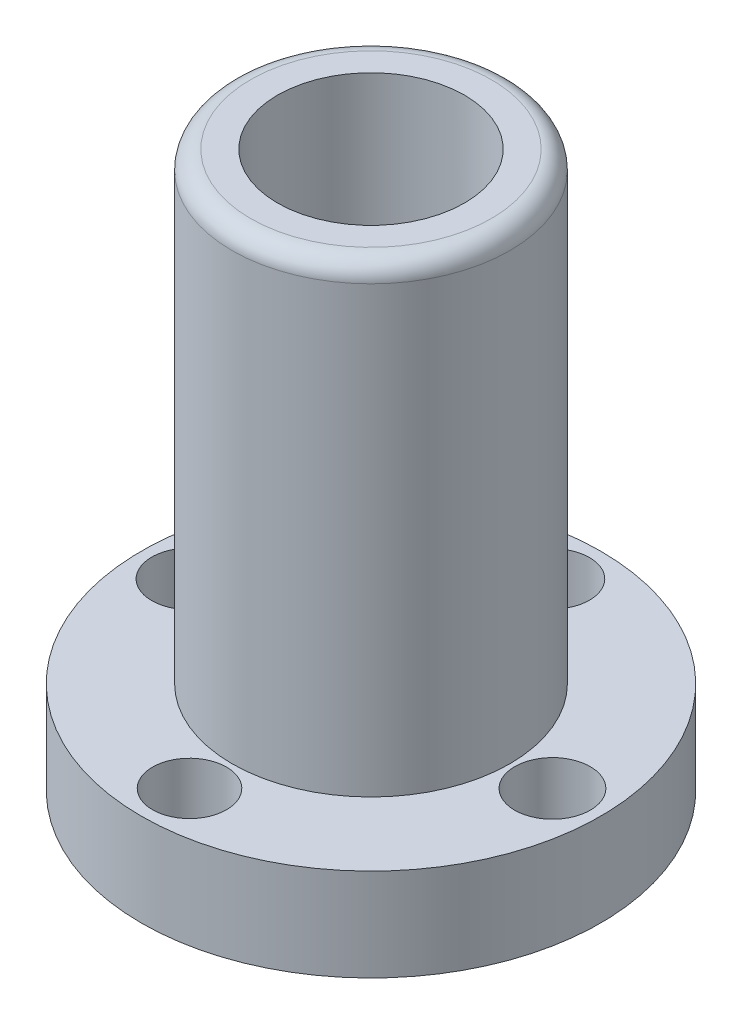
ISO-10303-21;
HEADER;
FILE_DESCRIPTION(('STEP AP214'),'2;1');
FILE_NAME('part.step','',(''),(''),'','','');
FILE_SCHEMA(('AUTOMOTIVE_DESIGN { 1 0 10303 214 1 1 1 1 }'));
ENDSEC;
DATA;
#1=APPLICATION_CONTEXT('core data for automotive mechanical design processes');
#2=APPLICATION_PROTOCOL_DEFINITION('international standard','automotive_design',2000,#1);
#3=PRODUCT_CONTEXT('',#1,'mechanical');
#4=PRODUCT('Part','Part','',(#3));
#5=PRODUCT_RELATED_PRODUCT_CATEGORY('part','',(#4));
#6=PRODUCT_DEFINITION_FORMATION('','',#4);
#7=PRODUCT_DEFINITION_CONTEXT('part definition',#1,'design');
#8=PRODUCT_DEFINITION('design','',#6,#7);
#9=PRODUCT_DEFINITION_SHAPE('','',#8);
#10=(LENGTH_UNIT() NAMED_UNIT(*) SI_UNIT(.MILLI.,.METRE.));
#11=(NAMED_UNIT(*) PLANE_ANGLE_UNIT() SI_UNIT($,.RADIAN.));
#12=(NAMED_UNIT(*) SI_UNIT($,.STERADIAN.) SOLID_ANGLE_UNIT());
#13=UNCERTAINTY_MEASURE_WITH_UNIT(LENGTH_MEASURE(1.E-05),#10,'distance_accuracy_value','');
#14=(GEOMETRIC_REPRESENTATION_CONTEXT(3) GLOBAL_UNCERTAINTY_ASSIGNED_CONTEXT((#13)) GLOBAL_UNIT_ASSIGNED_CONTEXT((#10,
#11,#12)) REPRESENTATION_CONTEXT('',''));
#15=CARTESIAN_POINT('',(0.,0.,0.));
#16=DIRECTION('',(0.,0.,1.));
#17=DIRECTION('',(1.,0.,0.));
#18=AXIS2_PLACEMENT_3D('',#15,#16,#17);
#19=CARTESIAN_POINT('',(0.,63.5,0.));
#20=DIRECTION('',(0.,-1.,0.));
#21=DIRECTION('',(0.,0.,-1.));
#22=AXIS2_PLACEMENT_3D('',#19,#20,#21);
#23=CYLINDRICAL_SURFACE('',#22,19.05);
#24=CARTESIAN_POINT('',(0.,60.96,0.));
#25=DIRECTION('',(0.,1.,0.));
#26=DIRECTION('',(0.,0.,1.));
#27=AXIS2_PLACEMENT_3D('',#24,#25,#26);
#28=CIRCLE('',#27,19.05);
#29=CARTESIAN_POINT('',(0.,60.96,19.05));
#30=VERTEX_POINT('',#29);
#31=EDGE_CURVE('E10',#30,#30,#28,.F.);
#32=ORIENTED_EDGE('',*,*,#31,.T.);
#33=EDGE_LOOP('',(#32));
#34=FACE_BOUND('',#33,.T.);
#35=CARTESIAN_POINT('',(0.,38.0825748199491,-19.05));
#36=CARTESIAN_POINT('',(-0.172758741358228,38.0825748790905,-19.0500000384333));
#37=CARTESIAN_POINT('',(-0.34551662965528,38.0754996208819,-19.0476445732295));
#38=CARTESIAN_POINT('',(-0.689812472477129,38.047261925439,-19.0382858165429));
#39=CARTESIAN_POINT('',(-0.861349961429442,38.0260943757799,-19.0312808383048));
#40=CARTESIAN_POINT('',(-1.20183631296349,37.9698760867755,-19.0128154502155));
#41=CARTESIAN_POINT('',(-1.37078591701533,37.9348294043391,-19.0013563423367));
#42=CARTESIAN_POINT('',(-1.70501431641908,37.8511572605666,-18.9742865479488));
#43=CARTESIAN_POINT('',(-1.8702916672818,37.8025265545438,-18.9586742580392));
#44=CARTESIAN_POINT('',(-2.1956424795937,37.6922304266037,-18.9237514775853));
#45=CARTESIAN_POINT('',(-2.35572606982077,37.630592385169,-18.9044487632974));
#46=CARTESIAN_POINT('',(-2.67007332741114,37.4946971090675,-18.8626181128214));
#47=CARTESIAN_POINT('',(-2.82433481554671,37.4204352053935,-18.8400889838129));
#48=CARTESIAN_POINT('',(-3.1259942833207,37.2598867496302,-18.7923914503261));
#49=CARTESIAN_POINT('',(-3.2733936927839,37.1736027176418,-18.7672235992545));
#50=CARTESIAN_POINT('',(-3.56054614434711,36.9895713739917,-18.7148690091986));
#51=CARTESIAN_POINT('',(-3.70029641674528,36.8918199498104,-18.6876815472167));
#52=CARTESIAN_POINT('',(-3.97548663151716,36.6823250581777,-18.6311122831325));
#53=CARTESIAN_POINT('',(-4.11065998429786,36.5702425918535,-18.6016886361541));
#54=CARTESIAN_POINT('',(-4.37116418252414,36.3353235369984,-18.5422026355642));
#55=CARTESIAN_POINT('',(-4.49649481057155,36.2124867110605,-18.5121402678639));
#56=CARTESIAN_POINT('',(-4.73659907435506,35.9567688923567,-18.4521665336531));
#57=CARTESIAN_POINT('',(-4.85136865466811,35.8238840765686,-18.4222552292831));
#58=CARTESIAN_POINT('',(-5.06953681577943,35.5489584882713,-18.3634163650611));
#59=CARTESIAN_POINT('',(-5.17293928190751,35.4069208707259,-18.3344884714248));
#60=CARTESIAN_POINT('',(-5.37056069778378,35.1102473225343,-18.2775944667648));
#61=CARTESIAN_POINT('',(-5.46442583457717,34.9553653425727,-18.2496806678776));
#62=CARTESIAN_POINT('',(-5.63868274825869,34.637827187178,-18.1965945848705));
#63=CARTESIAN_POINT('',(-5.71907983886636,34.475174110482,-18.1714212209111));
#64=CARTESIAN_POINT('',(-5.86579081226659,34.1431056198522,-18.1245947036832));
#65=CARTESIAN_POINT('',(-5.93210217996037,33.9736890046486,-18.1029421792454));
#66=CARTESIAN_POINT('',(-6.04999310442957,33.6294083627931,-18.0638850606314));
#67=CARTESIAN_POINT('',(-6.10157936553327,33.4545468555454,-18.046478533783));
#68=CARTESIAN_POINT('',(-6.18809247052206,33.1065016615772,-18.0169928528198));
#69=CARTESIAN_POINT('',(-6.22351480284536,32.9334544529906,-18.0047562505523));
#70=CARTESIAN_POINT('',(-6.27979113923005,32.5848012115491,-17.9852054127276));
#71=CARTESIAN_POINT('',(-6.30065121152858,32.409196275704,-17.9778891268728));
#72=CARTESIAN_POINT('',(-6.32761085318649,32.0567295112865,-17.9684180162086));
#73=CARTESIAN_POINT('',(-6.33371141708538,31.8798677682071,-17.9662628436281));
#74=CARTESIAN_POINT('',(-6.3310904123134,31.5262705079991,-17.9671866794293));
#75=CARTESIAN_POINT('',(-6.32236925888813,31.3495349874731,-17.9702655411742));
#76=CARTESIAN_POINT('',(-6.29093380941547,31.0056218671124,-17.9812933522872));
#77=CARTESIAN_POINT('',(-6.26887667601348,30.838376340971,-17.989013495871));
#78=CARTESIAN_POINT('',(-6.21154509447218,30.5063770757717,-18.0088902269284));
#79=CARTESIAN_POINT('',(-6.17626619713879,30.3416241949396,-18.0210483077557));
#80=CARTESIAN_POINT('',(-6.09281756533854,30.0158292212252,-18.049432471288));
#81=CARTESIAN_POINT('',(-6.04465144783841,29.8547861009028,-18.0656574124949));
#82=CARTESIAN_POINT('',(-5.93580628095184,29.5373375602914,-18.1017123095426));
#83=CARTESIAN_POINT('',(-5.87512248096222,29.3809339265919,-18.1215436337074));
#84=CARTESIAN_POINT('',(-5.74067868517598,29.0713749620272,-18.1645854568596));
#85=CARTESIAN_POINT('',(-5.66672888241313,28.9183087937848,-18.1878439895405));
#86=CARTESIAN_POINT('',(-5.50693648456175,28.618871598642,-18.2368619429469));
#87=CARTESIAN_POINT('',(-5.42108982569247,28.4725028823087,-18.2626222173249));
#88=CARTESIAN_POINT('',(-5.23809866873727,28.1873424380407,-18.3159466536954));
#89=CARTESIAN_POINT('',(-5.14095340835934,28.0485512222726,-18.3435109373455));
#90=CARTESIAN_POINT('',(-4.93597928793087,27.7793276345485,-18.3997255482519));
#91=CARTESIAN_POINT('',(-4.82815005226849,27.6488955567367,-18.4283759136692));
#92=CARTESIAN_POINT('',(-4.59655817548651,27.3905508155845,-18.4875408598896));
#93=CARTESIAN_POINT('',(-4.4722579513675,27.263123958766,-18.5180747627384));
#94=CARTESIAN_POINT('',(-4.21336009983195,27.0191727225032,-18.5786911215486));
#95=CARTESIAN_POINT('',(-4.07876573206832,26.9026449176287,-18.6087737168374));
#96=CARTESIAN_POINT('',(-3.80000614264082,26.6811577692198,-18.6676927700696));
#97=CARTESIAN_POINT('',(-3.65583640785801,26.5762039436953,-18.6965286296706));
#98=CARTESIAN_POINT('',(-3.35893929796405,26.3787053879637,-18.7521418648088));
#99=CARTESIAN_POINT('',(-3.20621534137352,26.2861557501402,-18.7789200526472));
#100=CARTESIAN_POINT('',(-2.89152254174225,26.113231138993,-18.8299564960847));
#101=CARTESIAN_POINT('',(-2.72947480342792,26.0329910958707,-18.8541860181795));
#102=CARTESIAN_POINT('',(-2.39875770675027,25.8865405747073,-18.8991082927784));
#103=CARTESIAN_POINT('',(-2.23009094374286,25.8203246616065,-18.9198024148254));
#104=CARTESIAN_POINT('',(-1.88730205631504,25.7024849212884,-18.9570648648825));
#105=CARTESIAN_POINT('',(-1.71318036910442,25.6508599279222,-18.9736335225992));
#106=CARTESIAN_POINT('',(-1.36078988405157,25.5626954161125,-19.0021575407015));
#107=CARTESIAN_POINT('',(-1.18252127631754,25.5261552075679,-19.0141131121257));
#108=CARTESIAN_POINT('',(-0.831000721606231,25.4697732164938,-19.0326448181413));
#109=CARTESIAN_POINT('',(-0.657864267968082,25.4492788797706,-19.0394308318231));
#110=CARTESIAN_POINT('',(-0.31037245729307,25.4226360300412,-19.0482642631045));
#111=CARTESIAN_POINT('',(-0.136017138267487,25.416487071647,-19.0503118278211));
#112=CARTESIAN_POINT('',(0.212569747668963,25.4185946459723,-19.0496112652542));
#113=CARTESIAN_POINT('',(0.386801329123272,25.4268490373734,-19.0468638508311));
#114=CARTESIAN_POINT('',(0.733851475677078,25.4576782131763,-19.0366514450436));
#115=CARTESIAN_POINT('',(0.90667005489474,25.4802528543183,-19.0291865008733));
#116=CARTESIAN_POINT('',(1.24463172118035,25.5386437736785,-19.0100291210048));
#117=CARTESIAN_POINT('',(1.40985202910706,25.5740568858467,-18.9984656160848));
#118=CARTESIAN_POINT('',(1.73668633540616,25.6578824799328,-18.9713815830356));
#119=CARTESIAN_POINT('',(1.89829911373565,25.7062992895795,-18.9558597376278));
#120=CARTESIAN_POINT('',(2.21676427021394,25.8157096956631,-18.9212607094191));
#121=CARTESIAN_POINT('',(2.37361791272227,25.8766999175586,-18.9021844807008));
#122=CARTESIAN_POINT('',(2.68169397444251,26.0108138228231,-18.8609433258));
#123=CARTESIAN_POINT('',(2.83291423786995,26.0839420939539,-18.8387772322652));
#124=CARTESIAN_POINT('',(3.13259439174383,26.2438271091812,-18.7913001240879));
#125=CARTESIAN_POINT('',(3.28088181749425,26.3308873394494,-18.7659226137298));
#126=CARTESIAN_POINT('',(3.56968695587054,26.5166142265103,-18.7131343046047));
#127=CARTESIAN_POINT('',(3.71020196444326,26.6152848857415,-18.6857228058751));
#128=CARTESIAN_POINT('',(3.98260890475969,26.8235682446168,-18.6295644224943));
#129=CARTESIAN_POINT('',(4.11450001390219,26.9331819855676,-18.6008174108995));
#130=CARTESIAN_POINT('',(4.36889239519896,27.1626663443282,-18.542715717156));
#131=CARTESIAN_POINT('',(4.49139342337646,27.2825372284719,-18.5133610192432));
#132=CARTESIAN_POINT('',(4.73163445893604,27.5374954676621,-18.453459064093));
#133=CARTESIAN_POINT('',(4.84890557627608,27.6730266443306,-18.4229181921575));
#134=CARTESIAN_POINT('',(5.07160309727794,27.9536307959917,-18.3628604139613));
#135=CARTESIAN_POINT('',(5.17703342108384,28.0987005876566,-18.3333431710569));
#136=CARTESIAN_POINT('',(5.37540532205743,28.3975824008164,-18.2761642905736));
#137=CARTESIAN_POINT('',(5.46834166691185,28.5513980468264,-18.2485034328378));
#138=CARTESIAN_POINT('',(5.64093843007773,28.8666687790544,-18.1958911392692));
#139=CARTESIAN_POINT('',(5.72060437603298,29.0281206483218,-18.1709385768414));
#140=CARTESIAN_POINT('',(5.86593291899585,29.3573736074323,-18.1245453503832));
#141=CARTESIAN_POINT('',(5.93161865497503,29.525163656059,-18.1030988971727));
#142=CARTESIAN_POINT('',(6.04854398349377,29.8660994864381,-18.0643685723504));
#143=CARTESIAN_POINT('',(6.09978950383178,30.0392430380571,-18.0470829930998));
#144=CARTESIAN_POINT('',(6.18736740881959,30.3896349509939,-18.0172452968136));
#145=CARTESIAN_POINT('',(6.22370229294923,30.566882619069,-18.0046923864662));
#146=CARTESIAN_POINT('',(6.28109446538322,30.9241192638955,-17.9847513163245));
#147=CARTESIAN_POINT('',(6.30215251791139,31.1041081030598,-17.977362898177));
#148=CARTESIAN_POINT('',(6.32808397957286,31.4560901044334,-17.9682505612009));
#149=CARTESIAN_POINT('',(6.33373249045736,31.6280195849512,-17.9662554108844));
#150=CARTESIAN_POINT('',(6.3310236609693,31.9718154189481,-17.9672102114742));
#151=CARTESIAN_POINT('',(6.32266155916293,32.1436817311045,-17.9701618435189));
#152=CARTESIAN_POINT('',(6.29201158853923,32.4859362493896,-17.9809163236018));
#153=CARTESIAN_POINT('',(6.2697297892027,32.6563250669447,-17.9887170572528));
#154=CARTESIAN_POINT('',(6.21145012744112,32.994526693111,-18.0089238084305));
#155=CARTESIAN_POINT('',(6.17544711354875,33.1623385095716,-18.0213315555606));
#156=CARTESIAN_POINT('',(6.09088005239366,33.4909524688672,-18.050086752918));
#157=CARTESIAN_POINT('',(6.04257067548311,33.6518273444269,-18.0663539151614));
#158=CARTESIAN_POINT('',(5.93346280866565,33.9689295510621,-18.1024810396607));
#159=CARTESIAN_POINT('',(5.87265988688725,34.1251552103316,-18.122342276554));
#160=CARTESIAN_POINT('',(5.73905817111509,34.4319209353972,-18.1650936181698));
#161=CARTESIAN_POINT('',(5.66626154802567,34.5824620240713,-18.1879831746077));
#162=CARTESIAN_POINT('',(5.50915674571604,34.8770716293237,-18.2361849828228));
#163=CARTESIAN_POINT('',(5.42484443010359,35.0211377953089,-18.2614981041538));
#164=CARTESIAN_POINT('',(5.24139286869342,35.3080238810844,-18.3150161912518));
#165=CARTESIAN_POINT('',(5.14176991966739,35.4505201430004,-18.3432988934858));
#166=CARTESIAN_POINT('',(4.93127584320059,35.7267036039243,-18.4010033731485));
#167=CARTESIAN_POINT('',(4.82040432973481,35.8603905003552,-18.4304251896474));
#168=CARTESIAN_POINT('',(4.58805512867713,36.1182241285312,-18.4896356258381));
#169=CARTESIAN_POINT('',(4.4665729785069,36.2423668045349,-18.5194243952933));
#170=CARTESIAN_POINT('',(4.21381192805015,36.4802647763996,-18.5785663572807));
#171=CARTESIAN_POINT('',(4.08253624850751,36.5940234600596,-18.607919689239));
#172=CARTESIAN_POINT('',(3.80560097562437,36.8147278498839,-18.666566493594));
#173=CARTESIAN_POINT('',(3.6595795141902,36.9212326701318,-18.6958126623739));
#174=CARTESIAN_POINT('',(3.35873886283523,37.1215004937406,-18.7521940558181));
#175=CARTESIAN_POINT('',(3.20392300011109,37.215268270987,-18.779330069736));
#176=CARTESIAN_POINT('',(2.88642833663928,37.3893990360078,-18.8307433232952));
#177=CARTESIAN_POINT('',(2.72374799457043,37.4697593822757,-18.8550199993188));
#178=CARTESIAN_POINT('',(2.39174278650552,37.6163430460394,-18.9000028993825));
#179=CARTESIAN_POINT('',(2.22242094129071,37.6825727043742,-18.9207107240619));
#180=CARTESIAN_POINT('',(1.88623566406596,37.7976203853797,-18.9571060605557));
#181=CARTESIAN_POINT('',(1.71961893912662,37.8471005004598,-18.9729810465308));
#182=CARTESIAN_POINT('',(1.38261535732259,37.9322381534811,-19.0005115816049));
#183=CARTESIAN_POINT('',(1.21223006436902,37.9679013156047,-19.0121688473964));
#184=CARTESIAN_POINT('',(0.868862755816188,38.0250994478533,-19.0309521166366));
#185=CARTESIAN_POINT('',(0.695880847853719,38.0466350019612,-19.0380783073827));
#186=CARTESIAN_POINT('',(0.348599003178901,38.0753726529962,-19.0476022279681));
#187=CARTESIAN_POINT('',(0.174299067419016,38.0825747602804,-19.049999961224));
#188=CARTESIAN_POINT('',(0.,38.0825748199491,-19.05));
#189=B_SPLINE_CURVE_WITH_KNOTS('',3,(#35,#36,#37,#38,#39,#40,#41,#42,#43,#44,#45,#46,#47,#48,
#49,#50,#51,#52,#53,#54,#55,#56,#57,#58,#59,#60,#61,#62,#63,#64,#65,#66,#67,#68,#69,#70,#71,#72,
#73,#74,#75,#76,#77,#78,#79,#80,#81,#82,#83,#84,#85,#86,#87,#88,#89,#90,#91,#92,#93,#94,#95,#96,
#97,#98,#99,#100,#101,#102,#103,#104,#105,#106,#107,#108,#109,#110,#111,#112,#113,#114,#115,
#116,#117,#118,#119,#120,#121,#122,#123,#124,#125,#126,#127,#128,#129,#130,#131,#132,#133,#134,
#135,#136,#137,#138,#139,#140,#141,#142,#143,#144,#145,#146,#147,#148,#149,#150,#151,#152,#153,
#154,#155,#156,#157,#158,#159,#160,#161,#162,#163,#164,#165,#166,#167,#168,#169,#170,#171,#172,
#173,#174,#175,#176,#177,#178,#179,#180,#181,#182,#183,#184,#185,#186,#187,#188),.UNSPECIFIED.,
.T.,.F.,(4,2,2,2,2,2,2,2,2,2,2,2,2,2,2,2,2,2,2,2,2,2,2,2,2,2,2,2,2,2,2,2,2,2,2,2,2,2,2,2,2,2,2,
2,2,2,2,2,2,2,2,2,2,2,2,2,2,2,2,2,2,2,2,2,2,2,2,2,2,2,2,2,2,2,2,2,4),(0.,0.518114661991829,
1.0364173889732,1.55456872632373,2.07292039507709,2.5901916259458,3.1076545904355,
3.62500924611267,4.14255000976625,4.67608140137753,5.20962457388746,5.74337177842157,
6.2769359748065,6.82599213909479,7.3748311644506,7.92376810641232,8.47245471774993,
9.00295576373811,9.53323561254375,10.0634797285226,10.5937089894141,11.0997260612526,
11.6059135636467,12.1119591466605,12.6181971342488,13.1323589842289,13.6466968987858,
14.1610695347517,14.6754602607119,15.2166666686309,15.7577024068138,16.2989949840644,
16.8400727670961,17.3867126049955,17.9331402030781,18.4795241167128,19.0258830315181,
19.5486644556744,20.0714296485698,20.5941171295866,21.1167993817171,21.6243176235166,
22.1320049809696,22.6395562586641,23.1472998118097,23.6681714284948,24.1892231331077,
24.7103244665889,25.2314393349431,25.7762208708535,26.3208215103471,26.8656495156014,
27.4102500079461,27.9539419863914,28.4974104496652,29.0407877737093,29.5841379134165,
30.0996045894849,30.6152464797551,31.1306636886924,31.6462745958407,32.1519774034641,
32.6578599111741,33.1636509526713,33.6696241524999,34.1974907662638,34.725375501334,
35.253483331027,35.7814182439863,36.3300150026599,36.8784055747567,37.4269040624597,
37.9751559033179,38.4981251894237,39.0208813769772,39.5436159543699,40.066350154048),.UNSPECIFIED.);
#190=CARTESIAN_POINT('',(0.,38.0825748199491,-19.05));
#191=VERTEX_POINT('',#190);
#192=EDGE_CURVE('E72',#191,#191,#189,.T.);
#193=ORIENTED_EDGE('',*,*,#192,.T.);
#194=EDGE_LOOP('',(#193));
#195=FACE_BOUND('',#194,.T.);
#196=CARTESIAN_POINT('',(0.,0.,0.));
#197=DIRECTION('',(0.,1.,0.));
#198=DIRECTION('',(0.,0.,1.));
#199=AXIS2_PLACEMENT_3D('',#196,#197,#198);
#200=CIRCLE('',#199,19.05);
#201=CARTESIAN_POINT('',(0.,0.,19.05));
#202=VERTEX_POINT('',#201);
#203=EDGE_CURVE('E73',#202,#202,#200,.T.);
#204=ORIENTED_EDGE('',*,*,#203,.T.);
#205=EDGE_LOOP('',(#204));
#206=FACE_BOUND('',#205,.T.);
#207=ADVANCED_FACE('F42',(#34,#195,#206),#23,.T.);
#208=CARTESIAN_POINT('',(0.,63.5,0.));
#209=DIRECTION('',(0.,1.,0.));
#210=DIRECTION('',(0.,0.,1.));
#211=AXIS2_PLACEMENT_3D('',#208,#209,#210);
#212=PLANE('',#211);
#213=CARTESIAN_POINT('',(0.,63.5,0.));
#214=DIRECTION('',(0.,1.,0.));
#215=DIRECTION('',(0.,0.,1.));
#216=AXIS2_PLACEMENT_3D('',#213,#214,#215);
#217=CIRCLE('',#216,16.51);
#218=CARTESIAN_POINT('',(0.,63.5,16.51));
#219=VERTEX_POINT('',#218);
#220=EDGE_CURVE('E50',#219,#219,#217,.T.);
#221=ORIENTED_EDGE('',*,*,#220,.T.);
#222=EDGE_LOOP('',(#221));
#223=FACE_BOUND('',#222,.T.);
#224=CARTESIAN_POINT('',(0.,63.5,0.));
#225=DIRECTION('',(0.,1.,0.));
#226=DIRECTION('',(0.,0.,1.));
#227=AXIS2_PLACEMENT_3D('',#224,#225,#226);
#228=CIRCLE('',#227,12.8267409186652);
#229=CARTESIAN_POINT('',(0.,63.5,12.8267409186652));
#230=VERTEX_POINT('',#229);
#231=EDGE_CURVE('E60',#230,#230,#228,.T.);
#232=ORIENTED_EDGE('',*,*,#231,.F.);
#233=EDGE_LOOP('',(#232));
#234=FACE_BOUND('',#233,.T.);
#235=ADVANCED_FACE('F97',(#223,#234),#212,.T.);
#236=CARTESIAN_POINT('',(0.,0.,0.));
#237=DIRECTION('',(0.,1.,0.));
#238=DIRECTION('',(0.,0.,1.));
#239=AXIS2_PLACEMENT_3D('',#236,#237,#238);
#240=CYLINDRICAL_SURFACE('',#239,12.8267409186652);
#241=CARTESIAN_POINT('',(6.33257481994908,31.75,-11.1545407231453));
#242=CARTESIAN_POINT('',(6.33257395522573,31.5846115485912,-11.1545418462882));
#243=CARTESIAN_POINT('',(6.32608686748633,31.4192048908853,-11.1582316740919));
#244=CARTESIAN_POINT('',(6.30022163847442,31.0896599382838,-11.172855713284));
#245=CARTESIAN_POINT('',(6.28083729207406,30.9255222924076,-11.1837934117569));
#246=CARTESIAN_POINT('',(6.22939136780348,30.5995867364371,-11.2125301537044));
#247=CARTESIAN_POINT('',(6.19730929859978,30.4377930486364,-11.2303402866076));
#248=CARTESIAN_POINT('',(6.12085106396105,30.117900463523,-11.2721941410523));
#249=CARTESIAN_POINT('',(6.07646956859785,29.9598032003283,-11.2962405647855));
#250=CARTESIAN_POINT('',(5.97618673446526,29.6492467394709,-11.3496112980179));
#251=CARTESIAN_POINT('',(5.92035244942743,29.4967605577903,-11.378904765998));
#252=CARTESIAN_POINT('',(5.79753121855598,29.1972829538074,-11.4419701673868));
#253=CARTESIAN_POINT('',(5.73053996248446,29.050293682088,-11.4757438305851));
#254=CARTESIAN_POINT('',(5.51366844456322,28.6187940863243,-11.5823430153814));
#255=CARTESIAN_POINT('',(5.34779212091162,28.3434507159982,-11.6605015753803));
#256=CARTESIAN_POINT('',(4.96278228222408,27.8013632384026,-11.829782502519));
#257=CARTESIAN_POINT('',(4.74044173600541,27.5370852181477,-11.9214418909347));
#258=CARTESIAN_POINT('',(4.255217258407,27.0475272705986,-12.1031132449223));
#259=CARTESIAN_POINT('',(3.9923136482261,26.822266385307,-12.1931243870244));
#260=CARTESIAN_POINT('',(3.56244518970597,26.5112395764945,-12.3230994601187));
#261=CARTESIAN_POINT('',(3.40796941909616,26.4094356295764,-12.3668149806703));
#262=CARTESIAN_POINT('',(3.08989072443749,26.2193257568565,-12.4500934484464));
#263=CARTESIAN_POINT('',(2.92629172201628,26.1310140915124,-12.4896581591458));
#264=CARTESIAN_POINT('',(2.59102278122359,25.9687553808677,-12.56349276183));
#265=CARTESIAN_POINT('',(2.41935473779839,25.8948049836714,-12.5977638889452));
#266=CARTESIAN_POINT('',(2.06914205514874,25.7620783680941,-12.659997827443));
#267=CARTESIAN_POINT('',(1.89059812724819,25.7033005848964,-12.6879612893245));
#268=CARTESIAN_POINT('',(1.54070802879147,25.6052136696448,-12.7350092217003));
#269=CARTESIAN_POINT('',(1.36972661453025,25.5648337215259,-12.7545764433047));
#270=CARTESIAN_POINT('',(1.02437525851534,25.4983543227087,-12.7869467415122));
#271=CARTESIAN_POINT('',(0.85000546133353,25.4722542641106,-12.7997501060543));
#272=CARTESIAN_POINT('',(0.499407091907305,25.4346880781008,-12.8182165611959));
#273=CARTESIAN_POINT('',(0.323179484120817,25.4232147015006,-12.8238831888452));
#274=CARTESIAN_POINT('',(-0.0296973459962893,25.4150364605138,-12.8279198396684));
#275=CARTESIAN_POINT('',(-0.206346542755705,25.4183307220716,-12.8262902946825));
#276=CARTESIAN_POINT('',(-0.54352474961013,25.4387292491249,-12.8162338772973));
#277=CARTESIAN_POINT('',(-0.704145710352763,25.4546338267889,-12.8083975537366));
#278=CARTESIAN_POINT('',(-1.02337431316326,25.498586109338,-12.7868521021665));
#279=CARTESIAN_POINT('',(-1.18198125339647,25.5266379338367,-12.7731409817968));
#280=CARTESIAN_POINT('',(-1.49599023244417,25.5945703591214,-12.7401810110075));
#281=CARTESIAN_POINT('',(-1.65139335898361,25.6344468721491,-12.7209340743714));
#282=CARTESIAN_POINT('',(-1.95812708549778,25.7256446615888,-12.6773432795665));
#283=CARTESIAN_POINT('',(-2.1094561014655,25.776970319399,-12.6529974703623));
#284=CARTESIAN_POINT('',(-2.40914865245478,25.8913674549285,-12.5993953962116));
#285=CARTESIAN_POINT('',(-2.55744342530434,25.9545898272592,-12.5700765874705));
#286=CARTESIAN_POINT('',(-2.84812199315762,26.0917697937827,-12.5074231466563));
#287=CARTESIAN_POINT('',(-2.99050362637973,26.1657312704135,-12.4740870629884));
#288=CARTESIAN_POINT('',(-3.40767593616868,26.4029035664914,-12.3691163936777));
#289=CARTESIAN_POINT('',(-3.67267542974453,26.5814720871163,-12.2924856151343));
#290=CARTESIAN_POINT('',(-4.19467304205508,26.993219373096,-12.1248561697713));
#291=CARTESIAN_POINT('',(-4.44864860963562,27.2299273732632,-12.033184100386));
#292=CARTESIAN_POINT('',(-4.91503249753492,27.7420311555854,-11.8503375516815));
#293=CARTESIAN_POINT('',(-5.12741022318647,28.0174551590287,-11.7591634861907));
#294=CARTESIAN_POINT('',(-5.41658165081921,28.4642312593089,-11.6274726870982));
#295=CARTESIAN_POINT('',(-5.5102504079949,28.6238128810434,-11.5832518746809));
#296=CARTESIAN_POINT('',(-5.68364964146006,28.9514409537742,-11.4991598727441));
#297=CARTESIAN_POINT('',(-5.7633863982901,29.1194835463289,-11.459286726362));
#298=CARTESIAN_POINT('',(-5.90809013784849,29.462930575345,-11.385357413542));
#299=CARTESIAN_POINT('',(-5.97306562159149,29.6383307052956,-11.3512979018579));
#300=CARTESIAN_POINT('',(-6.08750843441051,29.9953313832676,-11.2903381658117));
#301=CARTESIAN_POINT('',(-6.13697782202666,30.1769311046984,-11.2634369912032));
#302=CARTESIAN_POINT('',(-6.21644375397316,30.5303624670756,-11.2197593889779));
#303=CARTESIAN_POINT('',(-6.24766436876829,30.7018413669564,-11.202353791772));
#304=CARTESIAN_POINT('',(-6.29589373930124,31.0473972582605,-11.1753199115418));
#305=CARTESIAN_POINT('',(-6.31290328502001,31.2214741047186,-11.1656911962084));
#306=CARTESIAN_POINT('',(-6.3324458891797,31.5705995771392,-11.1546196134485));
#307=CARTESIAN_POINT('',(-6.3349872064442,31.7456475915974,-11.1531720760062));
#308=CARTESIAN_POINT('',(-6.32557457349717,32.0952201509267,-11.1585133334752));
#309=CARTESIAN_POINT('',(-6.31362154444269,32.2697447283572,-11.1653016049774));
#310=CARTESIAN_POINT('',(-6.27743279200579,32.5983576581412,-11.1856824745967));
#311=CARTESIAN_POINT('',(-6.25462899354304,32.7526561353254,-11.1984799583984));
#312=CARTESIAN_POINT('',(-6.1978424178765,33.05861432753,-11.230008312873));
#313=CARTESIAN_POINT('',(-6.16385593026739,33.2102731491061,-11.2487411528147));
#314=CARTESIAN_POINT('',(-6.08506759899199,33.5099578641745,-11.291556157383));
#315=CARTESIAN_POINT('',(-6.04026725212915,33.6579842573292,-11.3156375816469));
#316=CARTESIAN_POINT('',(-5.94027304029221,33.949651282642,-11.3684490140329));
#317=CARTESIAN_POINT('',(-5.88507512444833,34.0932901800082,-11.3971808333224));
#318=CARTESIAN_POINT('',(-5.69898888737631,34.5295356375898,-11.4920315716748));
#319=CARTESIAN_POINT('',(-5.55121550242197,34.8137241603549,-11.5647453237745));
#320=CARTESIAN_POINT('',(-5.21622690298867,35.3547239168417,-11.7196553434472));
#321=CARTESIAN_POINT('',(-5.0289915084513,35.6115210415841,-11.8018564528922));
#322=CARTESIAN_POINT('',(-4.59337254762436,36.1236211616766,-11.9786380882328));
#323=CARTESIAN_POINT('',(-4.3403115120967,36.3749021865777,-12.0735033212439));
#324=CARTESIAN_POINT('',(-3.93095241094463,36.7179927821788,-12.2103951104067));
#325=CARTESIAN_POINT('',(-3.78942839497423,36.826782225159,-12.2551541869456));
#326=CARTESIAN_POINT('',(-3.49711372544291,37.0323837338671,-12.341744689676));
#327=CARTESIAN_POINT('',(-3.34632705554382,37.1292008953703,-12.3835773581222));
#328=CARTESIAN_POINT('',(-3.03248317306152,37.3123170661126,-12.4641977172058));
#329=CARTESIAN_POINT('',(-2.8692157343149,37.398299929568,-12.5028855834763));
#330=CARTESIAN_POINT('',(-2.53488924555937,37.5560295917172,-12.5749289098243));
#331=CARTESIAN_POINT('',(-2.36383367981315,37.6277826810732,-12.6082867249244));
#332=CARTESIAN_POINT('',(-2.01516903736683,37.7562549590062,-12.668688285385));
#333=CARTESIAN_POINT('',(-1.83756302811296,37.8129810850963,-12.695734943734));
#334=CARTESIAN_POINT('',(-1.47715936169509,37.9107102919865,-12.7426955475624));
#335=CARTESIAN_POINT('',(-1.29436230382081,37.9517151798905,-12.7626103128116));
#336=CARTESIAN_POINT('',(-0.941873806371411,38.0144610067843,-12.7932237768819));
#337=CARTESIAN_POINT('',(-0.772489460633993,38.0376071153736,-12.8045922961871));
#338=CARTESIAN_POINT('',(-0.432091897604828,38.0701285716299,-12.8205928569196));
#339=CARTESIAN_POINT('',(-0.261078801878231,38.0795049390479,-12.8252253971957));
#340=CARTESIAN_POINT('',(0.0811437426864648,38.0843664586195,-12.8276253947486));
#341=CARTESIAN_POINT('',(0.2523531236922,38.0798554732176,-12.825394760858));
#342=CARTESIAN_POINT('',(0.593618281668555,38.0570091609566,-12.8141345398078));
#343=CARTESIAN_POINT('',(0.763674087722272,38.0386741839348,-12.8051051247018));
#344=CARTESIAN_POINT('',(1.09054823969655,37.9900125621592,-12.7812800061494));
#345=CARTESIAN_POINT('',(1.24752143978605,37.9605213486815,-12.7668868849505));
#346=CARTESIAN_POINT('',(1.55828294419176,37.8899230628507,-12.7326933496261));
#347=CARTESIAN_POINT('',(1.71207021497701,37.8488122824781,-12.71289120945));
#348=CARTESIAN_POINT('',(2.01541653314047,37.755395991817,-12.6683414817785));
#349=CARTESIAN_POINT('',(2.16497672827176,37.7030935540435,-12.643595251738));
#350=CARTESIAN_POINT('',(2.45912679751098,37.5877368658818,-12.5896922267));
#351=CARTESIAN_POINT('',(2.60371474461934,37.5246785022139,-12.5605337448531));
#352=CARTESIAN_POINT('',(2.89323851578363,37.3853857134858,-12.4970933060611));
#353=CARTESIAN_POINT('',(3.0379215119268,37.3087010284206,-12.4626448578155));
#354=CARTESIAN_POINT('',(3.32032697491403,37.1447774877072,-12.3903993538303));
#355=CARTESIAN_POINT('',(3.45804685206782,37.0575347457022,-12.352601066414));
#356=CARTESIAN_POINT('',(3.85978863863088,36.7808211691838,-12.2353975293854));
#357=CARTESIAN_POINT('',(4.11253843379119,36.5762943971323,-12.1521503980107));
#358=CARTESIAN_POINT('',(4.60616609246953,36.1101760052961,-11.9743068844265));
#359=CARTESIAN_POINT('',(4.84349612369533,35.8449683359733,-11.8793943319545));
#360=CARTESIAN_POINT('',(5.27164694188557,35.2767044337323,-11.6956986952567));
#361=CARTESIAN_POINT('',(5.4624283260295,34.9736164615214,-11.6069208492248));
#362=CARTESIAN_POINT('',(5.71149495369547,34.4912455348567,-11.485338159382));
#363=CARTESIAN_POINT('',(5.78914275666911,34.3232806347122,-11.4462815141619));
#364=CARTESIAN_POINT('',(5.92978231625968,33.9801359191968,-11.3740586569387));
#365=CARTESIAN_POINT('',(5.99278161071087,33.8049598694105,-11.3408894174811));
#366=CARTESIAN_POINT('',(6.10321550742379,33.4490871849476,-11.2818421610688));
#367=CARTESIAN_POINT('',(6.15069030427903,33.2684061522739,-11.2559453400201));
#368=CARTESIAN_POINT('',(6.22958826466165,32.9026831405116,-11.2124732279708));
#369=CARTESIAN_POINT('',(6.26102275067005,32.717644334263,-11.1948920677818));
#370=CARTESIAN_POINT('',(6.30027629432497,32.4019436361563,-11.1728297253471));
#371=CARTESIAN_POINT('',(6.31237766048793,32.271960470312,-11.1659865071193));
#372=CARTESIAN_POINT('',(6.32852752629938,32.0113220197868,-11.1568414149247));
#373=CARTESIAN_POINT('',(6.33257550313185,31.880666692022,-11.1545398357957));
#374=CARTESIAN_POINT('',(6.33257481994908,31.75,-11.1545407231453));
#375=B_SPLINE_CURVE_WITH_KNOTS('',3,(#241,#242,#243,#244,#245,#246,#247,#248,#249,#250,#251,
#252,#253,#254,#255,#256,#257,#258,#259,#260,#261,#262,#263,#264,#265,#266,#267,#268,#269,#270,
#271,#272,#273,#274,#275,#276,#277,#278,#279,#280,#281,#282,#283,#284,#285,#286,#287,#288,#289,
#290,#291,#292,#293,#294,#295,#296,#297,#298,#299,#300,#301,#302,#303,#304,#305,#306,#307,#308,
#309,#310,#311,#312,#313,#314,#315,#316,#317,#318,#319,#320,#321,#322,#323,#324,#325,#326,#327,
#328,#329,#330,#331,#332,#333,#334,#335,#336,#337,#338,#339,#340,#341,#342,#343,#344,#345,#346,
#347,#348,#349,#350,#351,#352,#353,#354,#355,#356,#357,#358,#359,#360,#361,#362,#363,#364,#365,
#366,#367,#368,#369,#370,#371,#372,#373,#374),.UNSPECIFIED.,.T.,.F.,(4,2,2,2,2,2,2,2,2,2,2,2,2,
2,2,2,2,2,2,2,2,2,2,2,2,2,2,2,2,2,2,2,2,2,2,2,2,2,2,2,2,2,2,2,2,2,2,2,2,2,2,2,2,2,2,2,2,2,2,2,2,
2,2,2,2,2,4),(0.,0.496030233158985,0.99229928907501,1.48937250113993,1.98666145648313,
2.48111798743246,2.97576598523731,3.96410778541166,5.03181581520324,6.10004347209452,
6.66972246026242,7.239158431291,7.8084613367726,8.37770550412298,8.90730369538471,
9.43687933972124,9.96619241678439,10.4954741656818,10.9796919608872,11.4640741023456,
11.9482889892263,12.4326894959953,12.9237080307711,13.4149045243001,14.3967119955819,
15.469594973327,16.543264103556,17.1133986966239,17.6832756063666,18.2528234874078,
18.8222957250234,19.3470500394788,19.871775181358,20.3962007670595,20.9205930257661,
21.389553516133,21.8586697643047,22.3277211168129,22.796955590068,23.778042420805,
24.7596321817553,25.8612436454377,26.4128236109352,26.9641679928166,27.529032468244,
28.093646670429,28.6579997505272,29.222287940659,29.7356212613024,30.2489165639005,
30.7620691182351,31.275208686895,31.7557628479075,32.2364705361578,32.7170464216879,
33.1978065027209,33.69925690045,34.2008924436931,35.2036729114646,36.3040212537382,
37.4052978199315,37.9720050806364,38.5384200763588,39.103356732496,39.6678940594756,
40.0597619431337,40.4516552655372),.UNSPECIFIED.);
#376=CARTESIAN_POINT('',(6.33257481994908,31.75,-11.1545407231453));
#377=VERTEX_POINT('',#376);
#378=EDGE_CURVE('E63',#377,#377,#375,.T.);
#379=ORIENTED_EDGE('',*,*,#378,.T.);
#380=EDGE_LOOP('',(#379));
#381=FACE_BOUND('',#380,.T.);
#382=CARTESIAN_POINT('',(0.,0.,0.));
#383=DIRECTION('',(0.,1.,0.));
#384=DIRECTION('',(0.,0.,1.));
#385=AXIS2_PLACEMENT_3D('',#382,#383,#384);
#386=CIRCLE('',#385,12.8267409186652);
#387=CARTESIAN_POINT('',(0.,0.,12.8267409186652));
#388=VERTEX_POINT('',#387);
#389=EDGE_CURVE('E55',#388,#388,#386,.T.);
#390=ORIENTED_EDGE('',*,*,#389,.F.);
#391=EDGE_LOOP('',(#390));
#392=FACE_BOUND('',#391,.T.);
#393=ORIENTED_EDGE('',*,*,#231,.T.);
#394=EDGE_LOOP('',(#393));
#395=FACE_BOUND('',#394,.T.);
#396=ADVANCED_FACE('F75',(#381,#392,#395),#240,.F.);
#397=CARTESIAN_POINT('',(0.,31.75,-19.05));
#398=DIRECTION('',(0.,0.,1.));
#399=DIRECTION('',(1.,0.,0.));
#400=AXIS2_PLACEMENT_3D('',#397,#398,#399);
#401=CYLINDRICAL_SURFACE('',#400,6.33257481994909);
#402=ORIENTED_EDGE('',*,*,#378,.F.);
#403=EDGE_LOOP('',(#402));
#404=FACE_BOUND('',#403,.T.);
#405=ORIENTED_EDGE('',*,*,#192,.F.);
#406=EDGE_LOOP('',(#405));
#407=FACE_BOUND('',#406,.T.);
#408=ADVANCED_FACE('F78',(#404,#407),#401,.F.);
#409=CARTESIAN_POINT('',(0.,60.96,0.));
#410=DIRECTION('',(0.,1.,0.));
#411=DIRECTION('',(0.,0.,1.));
#412=AXIS2_PLACEMENT_3D('',#409,#410,#411);
#413=TOROIDAL_SURFACE('',#412,16.51,2.54);
#414=ORIENTED_EDGE('',*,*,#31,.F.);
#415=EDGE_LOOP('',(#414));
#416=FACE_BOUND('',#415,.T.);
#417=ORIENTED_EDGE('',*,*,#220,.F.);
#418=EDGE_LOOP('',(#417));
#419=FACE_BOUND('',#418,.T.);
#420=ADVANCED_FACE('F44',(#416,#419),#413,.T.);
#421=CARTESIAN_POINT('',(0.,0.,0.));
#422=DIRECTION('',(0.,-1.,0.));
#423=DIRECTION('',(0.,0.,-1.));
#424=AXIS2_PLACEMENT_3D('',#421,#422,#423);
#425=PLANE('',#424);
#426=CARTESIAN_POINT('',(-24.892,0.,0.));
#427=DIRECTION('',(0.,-1.,0.));
#428=DIRECTION('',(0.,0.,1.));
#429=AXIS2_PLACEMENT_3D('',#426,#427,#428);
#430=CIRCLE('',#429,5.18294335917068);
#431=CARTESIAN_POINT('',(-24.892,0.,5.18294335917068));
#432=VERTEX_POINT('',#431);
#433=EDGE_CURVE('E144',#432,#432,#430,.T.);
#434=ORIENTED_EDGE('',*,*,#433,.T.);
#435=EDGE_LOOP('',(#434));
#436=FACE_BOUND('',#435,.T.);
#437=CARTESIAN_POINT('',(24.892,0.,0.));
#438=DIRECTION('',(0.,1.,0.));
#439=DIRECTION('',(0.,0.,1.));
#440=AXIS2_PLACEMENT_3D('',#437,#438,#439);
#441=CIRCLE('',#440,5.18294335917068);
#442=CARTESIAN_POINT('',(24.892,0.,5.18294335917068));
#443=VERTEX_POINT('',#442);
#444=EDGE_CURVE('E136',#443,#443,#441,.T.);
#445=ORIENTED_EDGE('',*,*,#444,.F.);
#446=EDGE_LOOP('',(#445));
#447=FACE_BOUND('',#446,.T.);
#448=CARTESIAN_POINT('',(0.,0.,24.892));
#449=DIRECTION('',(0.,-1.,0.));
#450=DIRECTION('',(0.,0.,-1.));
#451=AXIS2_PLACEMENT_3D('',#448,#449,#450);
#452=CIRCLE('',#451,5.07512331796715);
#453=CARTESIAN_POINT('',(0.,0.,19.8168766820329));
#454=VERTEX_POINT('',#453);
#455=EDGE_CURVE('E128',#454,#454,#452,.T.);
#456=ORIENTED_EDGE('',*,*,#455,.T.);
#457=EDGE_LOOP('',(#456));
#458=FACE_BOUND('',#457,.T.);
#459=CARTESIAN_POINT('',(0.,0.,-24.892));
#460=DIRECTION('',(0.,1.,0.));
#461=DIRECTION('',(0.,0.,1.));
#462=AXIS2_PLACEMENT_3D('',#459,#460,#461);
#463=CIRCLE('',#462,5.07512331796715);
#464=CARTESIAN_POINT('',(0.,0.,-19.8168766820329));
#465=VERTEX_POINT('',#464);
#466=EDGE_CURVE('E120',#465,#465,#463,.T.);
#467=ORIENTED_EDGE('',*,*,#466,.F.);
#468=EDGE_LOOP('',(#467));
#469=FACE_BOUND('',#468,.T.);
#470=ORIENTED_EDGE('',*,*,#203,.F.);
#471=EDGE_LOOP('',(#470));
#472=FACE_BOUND('',#471,.T.);
#473=CARTESIAN_POINT('',(0.,0.,0.));
#474=DIRECTION('',(0.,-1.,0.));
#475=DIRECTION('',(0.,0.,-1.));
#476=AXIS2_PLACEMENT_3D('',#473,#474,#475);
#477=CIRCLE('',#476,31.496);
#478=CARTESIAN_POINT('',(0.,0.,-31.496));
#479=VERTEX_POINT('',#478);
#480=EDGE_CURVE('E93',#479,#479,#477,.T.);
#481=ORIENTED_EDGE('',*,*,#480,.F.);
#482=EDGE_LOOP('',(#481));
#483=FACE_BOUND('',#482,.T.);
#484=ADVANCED_FACE('F150',(#436,#447,#458,#469,#472,#483),#425,.F.);
#485=CARTESIAN_POINT('',(0.,-12.7,0.));
#486=DIRECTION('',(0.,-1.,0.));
#487=DIRECTION('',(0.,0.,-1.));
#488=AXIS2_PLACEMENT_3D('',#485,#486,#487);
#489=PLANE('',#488);
#490=CARTESIAN_POINT('',(-24.892,-12.7,0.));
#491=DIRECTION('',(0.,-1.,0.));
#492=DIRECTION('',(0.,0.,1.));
#493=AXIS2_PLACEMENT_3D('',#490,#491,#492);
#494=CIRCLE('',#493,5.18294335917068);
#495=CARTESIAN_POINT('',(-24.892,-12.7,5.18294335917068));
#496=VERTEX_POINT('',#495);
#497=EDGE_CURVE('E140',#496,#496,#494,.T.);
#498=ORIENTED_EDGE('',*,*,#497,.F.);
#499=EDGE_LOOP('',(#498));
#500=FACE_BOUND('',#499,.T.);
#501=CARTESIAN_POINT('',(24.892,-12.7,0.));
#502=DIRECTION('',(0.,1.,0.));
#503=DIRECTION('',(0.,0.,1.));
#504=AXIS2_PLACEMENT_3D('',#501,#502,#503);
#505=CIRCLE('',#504,5.18294335917068);
#506=CARTESIAN_POINT('',(24.892,-12.7,5.18294335917068));
#507=VERTEX_POINT('',#506);
#508=EDGE_CURVE('E132',#507,#507,#505,.T.);
#509=ORIENTED_EDGE('',*,*,#508,.T.);
#510=EDGE_LOOP('',(#509));
#511=FACE_BOUND('',#510,.T.);
#512=CARTESIAN_POINT('',(0.,-12.7,24.892));
#513=DIRECTION('',(0.,-1.,0.));
#514=DIRECTION('',(0.,0.,-1.));
#515=AXIS2_PLACEMENT_3D('',#512,#513,#514);
#516=CIRCLE('',#515,5.07512331796715);
#517=CARTESIAN_POINT('',(0.,-12.7,19.8168766820329));
#518=VERTEX_POINT('',#517);
#519=EDGE_CURVE('E124',#518,#518,#516,.T.);
#520=ORIENTED_EDGE('',*,*,#519,.F.);
#521=EDGE_LOOP('',(#520));
#522=FACE_BOUND('',#521,.T.);
#523=CARTESIAN_POINT('',(0.,-12.7,-24.892));
#524=DIRECTION('',(0.,1.,0.));
#525=DIRECTION('',(0.,0.,1.));
#526=AXIS2_PLACEMENT_3D('',#523,#524,#525);
#527=CIRCLE('',#526,5.07512331796715);
#528=CARTESIAN_POINT('',(0.,-12.7,-19.8168766820329));
#529=VERTEX_POINT('',#528);
#530=EDGE_CURVE('E117',#529,#529,#527,.T.);
#531=ORIENTED_EDGE('',*,*,#530,.T.);
#532=EDGE_LOOP('',(#531));
#533=FACE_BOUND('',#532,.T.);
#534=CARTESIAN_POINT('',(0.,-12.7,0.));
#535=DIRECTION('',(0.,-1.,0.));
#536=DIRECTION('',(0.,0.,-1.));
#537=AXIS2_PLACEMENT_3D('',#534,#535,#536);
#538=CIRCLE('',#537,31.496);
#539=CARTESIAN_POINT('',(0.,-12.7,-31.496));
#540=VERTEX_POINT('',#539);
#541=EDGE_CURVE('E112',#540,#540,#538,.T.);
#542=ORIENTED_EDGE('',*,*,#541,.T.);
#543=EDGE_LOOP('',(#542));
#544=FACE_BOUND('',#543,.T.);
#545=ADVANCED_FACE('F174',(#500,#511,#522,#533,#544),#489,.T.);
#546=CARTESIAN_POINT('',(0.,-12.7,0.));
#547=DIRECTION('',(0.,1.,0.));
#548=DIRECTION('',(0.,0.,1.));
#549=AXIS2_PLACEMENT_3D('',#546,#547,#548);
#550=CYLINDRICAL_SURFACE('',#549,31.496);
#551=ORIENTED_EDGE('',*,*,#541,.F.);
#552=EDGE_LOOP('',(#551));
#553=FACE_BOUND('',#552,.T.);
#554=ORIENTED_EDGE('',*,*,#480,.T.);
#555=EDGE_LOOP('',(#554));
#556=FACE_BOUND('',#555,.T.);
#557=ADVANCED_FACE('F83',(#553,#556),#550,.T.);
#558=ORIENTED_EDGE('',*,*,#389,.T.);
#559=EDGE_LOOP('',(#558));
#560=FACE_BOUND('',#559,.T.);
#561=ADVANCED_FACE('F172',(#560),#425,.F.);
#562=CARTESIAN_POINT('',(0.,-12.7,-24.892));
#563=DIRECTION('',(0.,1.,0.));
#564=DIRECTION('',(0.,0.,1.));
#565=AXIS2_PLACEMENT_3D('',#562,#563,#564);
#566=CYLINDRICAL_SURFACE('',#565,5.07512331796715);
#567=ORIENTED_EDGE('',*,*,#530,.F.);
#568=EDGE_LOOP('',(#567));
#569=FACE_BOUND('',#568,.T.);
#570=ORIENTED_EDGE('',*,*,#466,.T.);
#571=EDGE_LOOP('',(#570));
#572=FACE_BOUND('',#571,.T.);
#573=ADVANCED_FACE('F168',(#569,#572),#566,.F.);
#574=CARTESIAN_POINT('',(0.,-12.7,24.892));
#575=DIRECTION('',(0.,1.,0.));
#576=DIRECTION('',(0.,0.,1.));
#577=AXIS2_PLACEMENT_3D('',#574,#575,#576);
#578=CYLINDRICAL_SURFACE('',#577,5.07512331796715);
#579=ORIENTED_EDGE('',*,*,#519,.T.);
#580=EDGE_LOOP('',(#579));
#581=FACE_BOUND('',#580,.T.);
#582=ORIENTED_EDGE('',*,*,#455,.F.);
#583=EDGE_LOOP('',(#582));
#584=FACE_BOUND('',#583,.T.);
#585=ADVANCED_FACE('F162',(#581,#584),#578,.F.);
#586=CARTESIAN_POINT('',(24.892,-12.7,0.));
#587=DIRECTION('',(0.,1.,0.));
#588=DIRECTION('',(0.,0.,1.));
#589=AXIS2_PLACEMENT_3D('',#586,#587,#588);
#590=CYLINDRICAL_SURFACE('',#589,5.18294335917068);
#591=ORIENTED_EDGE('',*,*,#508,.F.);
#592=EDGE_LOOP('',(#591));
#593=FACE_BOUND('',#592,.T.);
#594=ORIENTED_EDGE('',*,*,#444,.T.);
#595=EDGE_LOOP('',(#594));
#596=FACE_BOUND('',#595,.T.);
#597=ADVANCED_FACE('F155',(#593,#596),#590,.F.);
#598=CARTESIAN_POINT('',(-24.892,-12.7,0.));
#599=DIRECTION('',(0.,1.,0.));
#600=DIRECTION('',(0.,0.,1.));
#601=AXIS2_PLACEMENT_3D('',#598,#599,#600);
#602=CYLINDRICAL_SURFACE('',#601,5.18294335917068);
#603=ORIENTED_EDGE('',*,*,#497,.T.);
#604=EDGE_LOOP('',(#603));
#605=FACE_BOUND('',#604,.T.);
#606=ORIENTED_EDGE('',*,*,#433,.F.);
#607=EDGE_LOOP('',(#606));
#608=FACE_BOUND('',#607,.T.);
#609=ADVANCED_FACE('F153',(#605,#608),#602,.F.);
#610=CLOSED_SHELL('',(#207,#235,#396,#408,#420,#484,#545,#557,#561,#573,#585,#597,#609));
#611=MANIFOLD_SOLID_BREP('B2',#610);
#612=ADVANCED_BREP_SHAPE_REPRESENTATION('',(#18,#611),#14);
#613=SHAPE_DEFINITION_REPRESENTATION(#9,#612);
ENDSEC;
END-ISO-10303-21;
